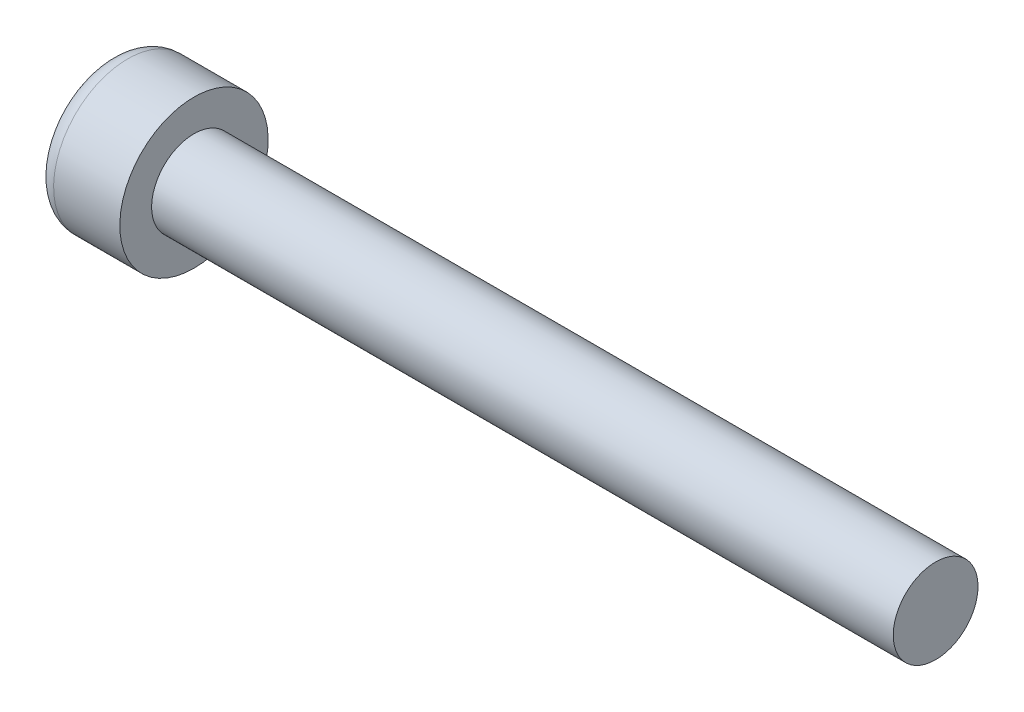
ISO-10303-21;
HEADER;
FILE_DESCRIPTION(('STEP AP214'),'2;1');
FILE_NAME('part.step','',(''),(''),'','','');
FILE_SCHEMA(('AUTOMOTIVE_DESIGN { 1 0 10303 214 1 1 1 1 }'));
ENDSEC;
DATA;
#1=APPLICATION_CONTEXT('core data for automotive mechanical design processes');
#2=APPLICATION_PROTOCOL_DEFINITION('international standard','automotive_design',2000,#1);
#3=PRODUCT_CONTEXT('',#1,'mechanical');
#4=PRODUCT('Part','Part','',(#3));
#5=PRODUCT_RELATED_PRODUCT_CATEGORY('part','',(#4));
#6=PRODUCT_DEFINITION_FORMATION('','',#4);
#7=PRODUCT_DEFINITION_CONTEXT('part definition',#1,'design');
#8=PRODUCT_DEFINITION('design','',#6,#7);
#9=PRODUCT_DEFINITION_SHAPE('','',#8);
#10=(LENGTH_UNIT() NAMED_UNIT(*) SI_UNIT(.MILLI.,.METRE.));
#11=(NAMED_UNIT(*) PLANE_ANGLE_UNIT() SI_UNIT($,.RADIAN.));
#12=(NAMED_UNIT(*) SI_UNIT($,.STERADIAN.) SOLID_ANGLE_UNIT());
#13=UNCERTAINTY_MEASURE_WITH_UNIT(LENGTH_MEASURE(1.E-05),#10,'distance_accuracy_value','');
#14=(GEOMETRIC_REPRESENTATION_CONTEXT(3) GLOBAL_UNCERTAINTY_ASSIGNED_CONTEXT((#13)) GLOBAL_UNIT_ASSIGNED_CONTEXT((#10,
#11,#12)) REPRESENTATION_CONTEXT('',''));
#15=CARTESIAN_POINT('',(0.,0.,0.));
#16=DIRECTION('',(0.,0.,1.));
#17=DIRECTION('',(1.,0.,0.));
#18=AXIS2_PLACEMENT_3D('',#15,#16,#17);
#19=CARTESIAN_POINT('',(0.,0.,0.));
#20=DIRECTION('',(1.,0.,0.));
#21=DIRECTION('',(0.,1.,0.));
#22=AXIS2_PLACEMENT_3D('',#19,#20,#21);
#23=PLANE('',#22);
#24=DIRECTION('',(0.,-0.5,-0.866025403784439));
#25=VECTOR('',#24,1.);
#26=CARTESIAN_POINT('',(0.,1.73205080756888,0.));
#27=LINE('',#26,#25);
#28=CARTESIAN_POINT('',(0.,1.73205080756888,0.));
#29=VERTEX_POINT('',#28);
#30=CARTESIAN_POINT('',(0.,0.866025403784439,-1.5));
#31=VERTEX_POINT('',#30);
#32=EDGE_CURVE('E121',#29,#31,#27,.T.);
#33=ORIENTED_EDGE('',*,*,#32,.F.);
#34=DIRECTION('',(0.,0.5,-0.866025403784439));
#35=VECTOR('',#34,1.);
#36=CARTESIAN_POINT('',(0.,0.866025403784439,1.5));
#37=LINE('',#36,#35);
#38=CARTESIAN_POINT('',(0.,0.866025403784439,1.5));
#39=VERTEX_POINT('',#38);
#40=EDGE_CURVE('E47',#39,#29,#37,.T.);
#41=ORIENTED_EDGE('',*,*,#40,.F.);
#42=DIRECTION('',(0.,1.,0.));
#43=VECTOR('',#42,1.);
#44=CARTESIAN_POINT('',(0.,-0.866025403784439,1.5));
#45=LINE('',#44,#43);
#46=CARTESIAN_POINT('',(0.,-0.866025403784439,1.5));
#47=VERTEX_POINT('',#46);
#48=EDGE_CURVE('E130',#47,#39,#45,.T.);
#49=ORIENTED_EDGE('',*,*,#48,.F.);
#50=DIRECTION('',(0.,0.5,0.866025403784439));
#51=VECTOR('',#50,1.);
#52=CARTESIAN_POINT('',(0.,-1.73205080756888,0.));
#53=LINE('',#52,#51);
#54=CARTESIAN_POINT('',(0.,-1.73205080756888,0.));
#55=VERTEX_POINT('',#54);
#56=EDGE_CURVE('E128',#55,#47,#53,.T.);
#57=ORIENTED_EDGE('',*,*,#56,.F.);
#58=DIRECTION('',(0.,-0.5,0.866025403784439));
#59=VECTOR('',#58,1.);
#60=CARTESIAN_POINT('',(0.,-0.866025403784439,-1.5));
#61=LINE('',#60,#59);
#62=CARTESIAN_POINT('',(0.,-0.866025403784439,-1.5));
#63=VERTEX_POINT('',#62);
#64=EDGE_CURVE('E95',#63,#55,#61,.T.);
#65=ORIENTED_EDGE('',*,*,#64,.F.);
#66=DIRECTION('',(0.,-1.,0.));
#67=VECTOR('',#66,1.);
#68=CARTESIAN_POINT('',(0.,0.866025403784439,-1.5));
#69=LINE('',#68,#67);
#70=EDGE_CURVE('E124',#31,#63,#69,.T.);
#71=ORIENTED_EDGE('',*,*,#70,.F.);
#72=EDGE_LOOP('',(#33,#41,#49,#57,#65,#71));
#73=FACE_BOUND('',#72,.T.);
#74=CARTESIAN_POINT('',(0.,0.,0.));
#75=DIRECTION('',(-1.,0.,0.));
#76=DIRECTION('',(0.,-1.,0.));
#77=AXIS2_PLACEMENT_3D('',#74,#75,#76);
#78=CIRCLE('',#77,2.625);
#79=CARTESIAN_POINT('',(0.,-2.625,0.));
#80=VERTEX_POINT('',#79);
#81=EDGE_CURVE('E11',#80,#80,#78,.T.);
#82=ORIENTED_EDGE('',*,*,#81,.T.);
#83=EDGE_LOOP('',(#82));
#84=FACE_BOUND('',#83,.T.);
#85=ADVANCED_FACE('F33',(#73,#84),#23,.F.);
#86=CARTESIAN_POINT('',(0.875,0.,0.));
#87=DIRECTION('',(-1.,0.,0.));
#88=DIRECTION('',(0.,-1.,0.));
#89=AXIS2_PLACEMENT_3D('',#86,#87,#88);
#90=TOROIDAL_SURFACE('',#89,2.625,0.875);
#91=ORIENTED_EDGE('',*,*,#81,.F.);
#92=EDGE_LOOP('',(#91));
#93=FACE_BOUND('',#92,.T.);
#94=CARTESIAN_POINT('',(0.875,0.,0.));
#95=DIRECTION('',(-1.,0.,0.));
#96=DIRECTION('',(0.,-1.,0.));
#97=AXIS2_PLACEMENT_3D('',#94,#95,#96);
#98=CIRCLE('',#97,3.5);
#99=CARTESIAN_POINT('',(0.875000000000001,-3.5,0.));
#100=VERTEX_POINT('',#99);
#101=EDGE_CURVE('E40',#100,#100,#98,.T.);
#102=ORIENTED_EDGE('',*,*,#101,.T.);
#103=EDGE_LOOP('',(#102));
#104=FACE_BOUND('',#103,.T.);
#105=ADVANCED_FACE('F150',(#93,#104),#90,.T.);
#106=CARTESIAN_POINT('',(0.,0.,0.));
#107=DIRECTION('',(-1.,0.,0.));
#108=DIRECTION('',(0.,-1.,0.));
#109=AXIS2_PLACEMENT_3D('',#106,#107,#108);
#110=CYLINDRICAL_SURFACE('',#109,3.5);
#111=ORIENTED_EDGE('',*,*,#101,.F.);
#112=EDGE_LOOP('',(#111));
#113=FACE_BOUND('',#112,.T.);
#114=CARTESIAN_POINT('',(4.,0.,0.));
#115=DIRECTION('',(-1.,0.,0.));
#116=DIRECTION('',(0.,-1.,0.));
#117=AXIS2_PLACEMENT_3D('',#114,#115,#116);
#118=CIRCLE('',#117,3.5);
#119=CARTESIAN_POINT('',(4.,-3.5,0.));
#120=VERTEX_POINT('',#119);
#121=EDGE_CURVE('E145',#120,#120,#118,.T.);
#122=ORIENTED_EDGE('',*,*,#121,.T.);
#123=EDGE_LOOP('',(#122));
#124=FACE_BOUND('',#123,.T.);
#125=ADVANCED_FACE('F152',(#113,#124),#110,.T.);
#126=CARTESIAN_POINT('',(4.,3.5,0.));
#127=DIRECTION('',(-1.,0.,0.));
#128=DIRECTION('',(0.,-1.,0.));
#129=AXIS2_PLACEMENT_3D('',#126,#127,#128);
#130=PLANE('',#129);
#131=ORIENTED_EDGE('',*,*,#121,.F.);
#132=EDGE_LOOP('',(#131));
#133=FACE_BOUND('',#132,.T.);
#134=CARTESIAN_POINT('',(4.,0.,0.));
#135=DIRECTION('',(-1.,0.,0.));
#136=DIRECTION('',(0.,-1.,0.));
#137=AXIS2_PLACEMENT_3D('',#134,#135,#136);
#138=CIRCLE('',#137,2.);
#139=CARTESIAN_POINT('',(4.,-2.,0.));
#140=VERTEX_POINT('',#139);
#141=EDGE_CURVE('E142',#140,#140,#138,.T.);
#142=ORIENTED_EDGE('',*,*,#141,.T.);
#143=EDGE_LOOP('',(#142));
#144=FACE_BOUND('',#143,.T.);
#145=ADVANCED_FACE('F155',(#133,#144),#130,.F.);
#146=CARTESIAN_POINT('',(0.,0.,0.));
#147=DIRECTION('',(-1.,0.,0.));
#148=DIRECTION('',(0.,-1.,0.));
#149=AXIS2_PLACEMENT_3D('',#146,#147,#148);
#150=CYLINDRICAL_SURFACE('',#149,1.99999999999999);
#151=ORIENTED_EDGE('',*,*,#141,.F.);
#152=EDGE_LOOP('',(#151));
#153=FACE_BOUND('',#152,.T.);
#154=CARTESIAN_POINT('',(39.,0.,0.));
#155=DIRECTION('',(-1.,0.,0.));
#156=DIRECTION('',(0.,-1.,0.));
#157=AXIS2_PLACEMENT_3D('',#154,#155,#156);
#158=CIRCLE('',#157,1.99999999999999);
#159=CARTESIAN_POINT('',(39.,-1.99999999999999,0.));
#160=VERTEX_POINT('',#159);
#161=EDGE_CURVE('E134',#160,#160,#158,.T.);
#162=ORIENTED_EDGE('',*,*,#161,.T.);
#163=EDGE_LOOP('',(#162));
#164=FACE_BOUND('',#163,.T.);
#165=ADVANCED_FACE('F161',(#153,#164),#150,.T.);
#166=CARTESIAN_POINT('',(39.,2.,0.));
#167=DIRECTION('',(-1.,0.,0.));
#168=DIRECTION('',(0.,-1.,0.));
#169=AXIS2_PLACEMENT_3D('',#166,#167,#168);
#170=PLANE('',#169);
#171=ORIENTED_EDGE('',*,*,#161,.F.);
#172=EDGE_LOOP('',(#171));
#173=FACE_BOUND('',#172,.T.);
#174=ADVANCED_FACE('F167',(#173),#170,.F.);
#175=CARTESIAN_POINT('',(2.,0.866025403784439,1.5));
#176=DIRECTION('',(0.,0.866025403784439,0.5));
#177=DIRECTION('',(0.,-0.5,0.866025403784439));
#178=AXIS2_PLACEMENT_3D('',#175,#176,#177);
#179=PLANE('',#178);
#180=ORIENTED_EDGE('',*,*,#40,.T.);
#181=DIRECTION('',(-1.,0.,0.));
#182=VECTOR('',#181,1.);
#183=CARTESIAN_POINT('',(2.,1.73205080756888,0.));
#184=LINE('',#183,#182);
#185=CARTESIAN_POINT('',(2.,1.73205080756888,0.));
#186=VERTEX_POINT('',#185);
#187=EDGE_CURVE('E77',#186,#29,#184,.T.);
#188=ORIENTED_EDGE('',*,*,#187,.F.);
#189=DIRECTION('',(0.,0.5,-0.866025403784439));
#190=VECTOR('',#189,1.);
#191=CARTESIAN_POINT('',(2.,0.866025403784439,1.5));
#192=LINE('',#191,#190);
#193=CARTESIAN_POINT('',(2.,0.866025403784439,1.5));
#194=VERTEX_POINT('',#193);
#195=EDGE_CURVE('E132',#194,#186,#192,.T.);
#196=ORIENTED_EDGE('',*,*,#195,.F.);
#197=DIRECTION('',(-1.,0.,0.));
#198=VECTOR('',#197,1.);
#199=CARTESIAN_POINT('',(2.,0.866025403784439,1.5));
#200=LINE('',#199,#198);
#201=EDGE_CURVE('E55',#194,#39,#200,.T.);
#202=ORIENTED_EDGE('',*,*,#201,.T.);
#203=EDGE_LOOP('',(#180,#188,#196,#202));
#204=FACE_BOUND('',#203,.T.);
#205=ADVANCED_FACE('F172',(#204),#179,.F.);
#206=CARTESIAN_POINT('',(2.,-0.866025403784439,1.5));
#207=DIRECTION('',(0.,0.,1.));
#208=DIRECTION('',(0.,-1.,0.));
#209=AXIS2_PLACEMENT_3D('',#206,#207,#208);
#210=PLANE('',#209);
#211=ORIENTED_EDGE('',*,*,#48,.T.);
#212=ORIENTED_EDGE('',*,*,#201,.F.);
#213=DIRECTION('',(0.,1.,0.));
#214=VECTOR('',#213,1.);
#215=CARTESIAN_POINT('',(2.,-0.866025403784439,1.5));
#216=LINE('',#215,#214);
#217=CARTESIAN_POINT('',(2.,-0.866025403784439,1.5));
#218=VERTEX_POINT('',#217);
#219=EDGE_CURVE('E107',#218,#194,#216,.T.);
#220=ORIENTED_EDGE('',*,*,#219,.F.);
#221=DIRECTION('',(-1.,0.,0.));
#222=VECTOR('',#221,1.);
#223=CARTESIAN_POINT('',(2.,-0.866025403784439,1.5));
#224=LINE('',#223,#222);
#225=EDGE_CURVE('E99',#218,#47,#224,.T.);
#226=ORIENTED_EDGE('',*,*,#225,.T.);
#227=EDGE_LOOP('',(#211,#212,#220,#226));
#228=FACE_BOUND('',#227,.T.);
#229=ADVANCED_FACE('F177',(#228),#210,.F.);
#230=CARTESIAN_POINT('',(2.,-1.73205080756888,0.));
#231=DIRECTION('',(0.,-0.866025403784439,0.5));
#232=DIRECTION('',(0.,-0.5,-0.866025403784439));
#233=AXIS2_PLACEMENT_3D('',#230,#231,#232);
#234=PLANE('',#233);
#235=ORIENTED_EDGE('',*,*,#56,.T.);
#236=ORIENTED_EDGE('',*,*,#225,.F.);
#237=DIRECTION('',(0.,0.5,0.866025403784439));
#238=VECTOR('',#237,1.);
#239=CARTESIAN_POINT('',(2.,-1.73205080756888,0.));
#240=LINE('',#239,#238);
#241=CARTESIAN_POINT('',(2.,-1.73205080756888,0.));
#242=VERTEX_POINT('',#241);
#243=EDGE_CURVE('E103',#242,#218,#240,.T.);
#244=ORIENTED_EDGE('',*,*,#243,.F.);
#245=DIRECTION('',(-1.,0.,0.));
#246=VECTOR('',#245,1.);
#247=CARTESIAN_POINT('',(2.,-1.73205080756888,0.));
#248=LINE('',#247,#246);
#249=EDGE_CURVE('E88',#242,#55,#248,.T.);
#250=ORIENTED_EDGE('',*,*,#249,.T.);
#251=EDGE_LOOP('',(#235,#236,#244,#250));
#252=FACE_BOUND('',#251,.T.);
#253=ADVANCED_FACE('F104',(#252),#234,.F.);
#254=CARTESIAN_POINT('',(2.,-0.866025403784439,-1.5));
#255=DIRECTION('',(0.,-0.866025403784439,-0.5));
#256=DIRECTION('',(0.,0.5,-0.866025403784439));
#257=AXIS2_PLACEMENT_3D('',#254,#255,#256);
#258=PLANE('',#257);
#259=ORIENTED_EDGE('',*,*,#64,.T.);
#260=ORIENTED_EDGE('',*,*,#249,.F.);
#261=DIRECTION('',(0.,-0.5,0.866025403784439));
#262=VECTOR('',#261,1.);
#263=CARTESIAN_POINT('',(2.,-0.866025403784439,-1.5));
#264=LINE('',#263,#262);
#265=CARTESIAN_POINT('',(2.,-0.866025403784439,-1.5));
#266=VERTEX_POINT('',#265);
#267=EDGE_CURVE('E92',#266,#242,#264,.T.);
#268=ORIENTED_EDGE('',*,*,#267,.F.);
#269=DIRECTION('',(-1.,0.,0.));
#270=VECTOR('',#269,1.);
#271=CARTESIAN_POINT('',(2.,-0.866025403784439,-1.5));
#272=LINE('',#271,#270);
#273=EDGE_CURVE('E100',#266,#63,#272,.T.);
#274=ORIENTED_EDGE('',*,*,#273,.T.);
#275=EDGE_LOOP('',(#259,#260,#268,#274));
#276=FACE_BOUND('',#275,.T.);
#277=ADVANCED_FACE('F90',(#276),#258,.F.);
#278=CARTESIAN_POINT('',(2.,0.866025403784439,-1.5));
#279=DIRECTION('',(0.,0.,-1.));
#280=DIRECTION('',(-1.,0.,0.));
#281=AXIS2_PLACEMENT_3D('',#278,#279,#280);
#282=PLANE('',#281);
#283=ORIENTED_EDGE('',*,*,#70,.T.);
#284=ORIENTED_EDGE('',*,*,#273,.F.);
#285=DIRECTION('',(0.,-1.,0.));
#286=VECTOR('',#285,1.);
#287=CARTESIAN_POINT('',(2.,0.866025403784439,-1.5));
#288=LINE('',#287,#286);
#289=CARTESIAN_POINT('',(2.,0.866025403784439,-1.5));
#290=VERTEX_POINT('',#289);
#291=EDGE_CURVE('E113',#290,#266,#288,.T.);
#292=ORIENTED_EDGE('',*,*,#291,.F.);
#293=DIRECTION('',(-1.,0.,0.));
#294=VECTOR('',#293,1.);
#295=CARTESIAN_POINT('',(2.,0.866025403784439,-1.5));
#296=LINE('',#295,#294);
#297=EDGE_CURVE('E137',#290,#31,#296,.T.);
#298=ORIENTED_EDGE('',*,*,#297,.T.);
#299=EDGE_LOOP('',(#283,#284,#292,#298));
#300=FACE_BOUND('',#299,.T.);
#301=ADVANCED_FACE('F203',(#300),#282,.F.);
#302=CARTESIAN_POINT('',(2.,1.73205080756888,0.));
#303=DIRECTION('',(0.,0.866025403784439,-0.5));
#304=DIRECTION('',(0.,0.5,0.866025403784439));
#305=AXIS2_PLACEMENT_3D('',#302,#303,#304);
#306=PLANE('',#305);
#307=ORIENTED_EDGE('',*,*,#32,.T.);
#308=ORIENTED_EDGE('',*,*,#297,.F.);
#309=DIRECTION('',(0.,-0.5,-0.866025403784439));
#310=VECTOR('',#309,1.);
#311=CARTESIAN_POINT('',(2.,1.73205080756888,0.));
#312=LINE('',#311,#310);
#313=EDGE_CURVE('E115',#186,#290,#312,.T.);
#314=ORIENTED_EDGE('',*,*,#313,.F.);
#315=ORIENTED_EDGE('',*,*,#187,.T.);
#316=EDGE_LOOP('',(#307,#308,#314,#315));
#317=FACE_BOUND('',#316,.T.);
#318=ADVANCED_FACE('F191',(#317),#306,.F.);
#319=CARTESIAN_POINT('',(2.,0.,0.));
#320=DIRECTION('',(-1.,0.,0.));
#321=DIRECTION('',(0.,-1.,0.));
#322=AXIS2_PLACEMENT_3D('',#319,#320,#321);
#323=PLANE('',#322);
#324=ORIENTED_EDGE('',*,*,#195,.T.);
#325=ORIENTED_EDGE('',*,*,#313,.T.);
#326=ORIENTED_EDGE('',*,*,#291,.T.);
#327=ORIENTED_EDGE('',*,*,#267,.T.);
#328=ORIENTED_EDGE('',*,*,#243,.T.);
#329=ORIENTED_EDGE('',*,*,#219,.T.);
#330=EDGE_LOOP('',(#324,#325,#326,#327,#328,#329));
#331=FACE_BOUND('',#330,.T.);
#332=ADVANCED_FACE('F110',(#331),#323,.T.);
#333=CLOSED_SHELL('',(#85,#105,#125,#145,#165,#174,#205,#229,#253,#277,#301,#318,#332));
#334=MANIFOLD_SOLID_BREP('B2',#333);
#335=ADVANCED_BREP_SHAPE_REPRESENTATION('',(#18,#334),#14);
#336=SHAPE_DEFINITION_REPRESENTATION(#9,#335);
ENDSEC;
END-ISO-10303-21;
